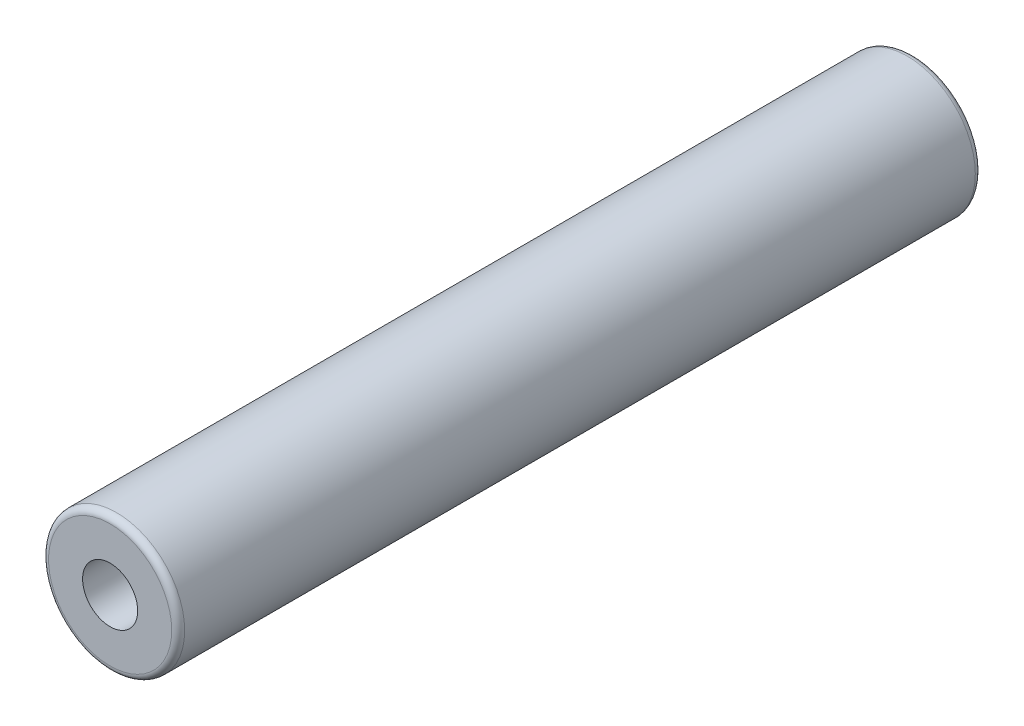
ISO-10303-21;
HEADER;
FILE_DESCRIPTION(('STEP AP214'),'2;1');
FILE_NAME('part.step','',(''),(''),'','','');
FILE_SCHEMA(('AUTOMOTIVE_DESIGN { 1 0 10303 214 1 1 1 1 }'));
ENDSEC;
DATA;
#1=APPLICATION_CONTEXT('core data for automotive mechanical design processes');
#2=APPLICATION_PROTOCOL_DEFINITION('international standard','automotive_design',2000,#1);
#3=PRODUCT_CONTEXT('',#1,'mechanical');
#4=PRODUCT('Part','Part','',(#3));
#5=PRODUCT_RELATED_PRODUCT_CATEGORY('part','',(#4));
#6=PRODUCT_DEFINITION_FORMATION('','',#4);
#7=PRODUCT_DEFINITION_CONTEXT('part definition',#1,'design');
#8=PRODUCT_DEFINITION('design','',#6,#7);
#9=PRODUCT_DEFINITION_SHAPE('','',#8);
#10=(LENGTH_UNIT() NAMED_UNIT(*) SI_UNIT(.MILLI.,.METRE.));
#11=(NAMED_UNIT(*) PLANE_ANGLE_UNIT() SI_UNIT($,.RADIAN.));
#12=(NAMED_UNIT(*) SI_UNIT($,.STERADIAN.) SOLID_ANGLE_UNIT());
#13=UNCERTAINTY_MEASURE_WITH_UNIT(LENGTH_MEASURE(1.E-05),#10,'distance_accuracy_value','');
#14=(GEOMETRIC_REPRESENTATION_CONTEXT(3) GLOBAL_UNCERTAINTY_ASSIGNED_CONTEXT((#13)) GLOBAL_UNIT_ASSIGNED_CONTEXT((#10,
#11,#12)) REPRESENTATION_CONTEXT('',''));
#15=CARTESIAN_POINT('',(0.,0.,0.));
#16=DIRECTION('',(0.,0.,1.));
#17=DIRECTION('',(1.,0.,0.));
#18=AXIS2_PLACEMENT_3D('',#15,#16,#17);
#19=CARTESIAN_POINT('',(-69.9999999999881,54.0000000000047,-124.));
#20=DIRECTION('',(0.,0.,1.));
#21=DIRECTION('',(1.,0.,0.));
#22=AXIS2_PLACEMENT_3D('',#19,#20,#21);
#23=CYLINDRICAL_SURFACE('',#22,10.5);
#24=CARTESIAN_POINT('',(-69.9999999999881,54.0000000000047,-123.));
#25=DIRECTION('',(0.,0.,1.));
#26=DIRECTION('',(1.,0.,0.));
#27=AXIS2_PLACEMENT_3D('',#24,#25,#26);
#28=CIRCLE('',#27,10.5);
#29=CARTESIAN_POINT('',(-59.4999999999882,54.0000000000047,-123.));
#30=VERTEX_POINT('',#29);
#31=EDGE_CURVE('E88',#30,#30,#28,.T.);
#32=ORIENTED_EDGE('',*,*,#31,.T.);
#33=EDGE_LOOP('',(#32));
#34=FACE_BOUND('',#33,.T.);
#35=CARTESIAN_POINT('',(-69.9999999999881,54.0000000000047,-1.));
#36=DIRECTION('',(0.,0.,1.));
#37=DIRECTION('',(1.,0.,0.));
#38=AXIS2_PLACEMENT_3D('',#35,#36,#37);
#39=CIRCLE('',#38,10.5);
#40=CARTESIAN_POINT('',(-59.4999999999882,54.0000000000047,-1.));
#41=VERTEX_POINT('',#40);
#42=EDGE_CURVE('E84',#41,#41,#39,.F.);
#43=ORIENTED_EDGE('',*,*,#42,.T.);
#44=EDGE_LOOP('',(#43));
#45=FACE_BOUND('',#44,.T.);
#46=ADVANCED_FACE('F42',(#34,#45),#23,.T.);
#47=CARTESIAN_POINT('',(-69.9999999999881,54.0000000000047,-124.));
#48=DIRECTION('',(0.,0.,1.));
#49=DIRECTION('',(1.,0.,0.));
#50=AXIS2_PLACEMENT_3D('',#47,#48,#49);
#51=PLANE('',#50);
#52=CARTESIAN_POINT('',(-69.9999999999881,54.0000000000047,-124.));
#53=DIRECTION('',(0.,0.,-1.));
#54=DIRECTION('',(-1.,0.,0.));
#55=AXIS2_PLACEMENT_3D('',#52,#53,#54);
#56=CIRCLE('',#55,4.24999999999999);
#57=CARTESIAN_POINT('',(-74.2499999999881,54.0000000000047,-124.));
#58=VERTEX_POINT('',#57);
#59=EDGE_CURVE('E69',#58,#58,#56,.T.);
#60=ORIENTED_EDGE('',*,*,#59,.F.);
#61=EDGE_LOOP('',(#60));
#62=FACE_BOUND('',#61,.T.);
#63=CARTESIAN_POINT('',(-69.9999999999881,54.0000000000047,-124.));
#64=DIRECTION('',(0.,0.,1.));
#65=DIRECTION('',(1.,0.,0.));
#66=AXIS2_PLACEMENT_3D('',#63,#64,#65);
#67=CIRCLE('',#66,9.5);
#68=CARTESIAN_POINT('',(-60.4999999999882,54.0000000000047,-124.));
#69=VERTEX_POINT('',#68);
#70=EDGE_CURVE('E51',#69,#69,#67,.F.);
#71=ORIENTED_EDGE('',*,*,#70,.T.);
#72=EDGE_LOOP('',(#71));
#73=FACE_BOUND('',#72,.T.);
#74=ADVANCED_FACE('F97',(#62,#73),#51,.F.);
#75=CARTESIAN_POINT('',(-69.9999999999881,54.0000000000047,0.));
#76=DIRECTION('',(0.,0.,1.));
#77=DIRECTION('',(1.,0.,0.));
#78=AXIS2_PLACEMENT_3D('',#75,#76,#77);
#79=PLANE('',#78);
#80=CARTESIAN_POINT('',(-69.9999999999881,54.0000000000047,0.));
#81=DIRECTION('',(0.,0.,1.));
#82=DIRECTION('',(1.,0.,0.));
#83=AXIS2_PLACEMENT_3D('',#80,#81,#82);
#84=CIRCLE('',#83,4.24999999999999);
#85=CARTESIAN_POINT('',(-65.7499999999882,54.0000000000047,0.));
#86=VERTEX_POINT('',#85);
#87=EDGE_CURVE('E68',#86,#86,#84,.T.);
#88=ORIENTED_EDGE('',*,*,#87,.F.);
#89=EDGE_LOOP('',(#88));
#90=FACE_BOUND('',#89,.T.);
#91=CARTESIAN_POINT('',(-69.9999999999881,54.0000000000047,0.));
#92=DIRECTION('',(0.,0.,1.));
#93=DIRECTION('',(1.,0.,0.));
#94=AXIS2_PLACEMENT_3D('',#91,#92,#93);
#95=CIRCLE('',#94,9.5);
#96=CARTESIAN_POINT('',(-60.4999999999882,54.0000000000047,0.));
#97=VERTEX_POINT('',#96);
#98=EDGE_CURVE('E11',#97,#97,#95,.T.);
#99=ORIENTED_EDGE('',*,*,#98,.T.);
#100=EDGE_LOOP('',(#99));
#101=FACE_BOUND('',#100,.T.);
#102=ADVANCED_FACE('F102',(#90,#101),#79,.T.);
#103=CARTESIAN_POINT('',(-69.9999999999881,54.0000000000047,-123.));
#104=DIRECTION('',(0.,0.,1.));
#105=DIRECTION('',(1.,0.,0.));
#106=AXIS2_PLACEMENT_3D('',#103,#104,#105);
#107=TOROIDAL_SURFACE('',#106,9.5,1.);
#108=ORIENTED_EDGE('',*,*,#70,.F.);
#109=EDGE_LOOP('',(#108));
#110=FACE_BOUND('',#109,.T.);
#111=ORIENTED_EDGE('',*,*,#31,.F.);
#112=EDGE_LOOP('',(#111));
#113=FACE_BOUND('',#112,.T.);
#114=ADVANCED_FACE('F99',(#110,#113),#107,.T.);
#115=CARTESIAN_POINT('',(-69.9999999999881,54.0000000000047,-1.));
#116=DIRECTION('',(0.,0.,1.));
#117=DIRECTION('',(1.,0.,0.));
#118=AXIS2_PLACEMENT_3D('',#115,#116,#117);
#119=TOROIDAL_SURFACE('',#118,9.5,1.);
#120=ORIENTED_EDGE('',*,*,#42,.F.);
#121=EDGE_LOOP('',(#120));
#122=FACE_BOUND('',#121,.T.);
#123=ORIENTED_EDGE('',*,*,#98,.F.);
#124=EDGE_LOOP('',(#123));
#125=FACE_BOUND('',#124,.T.);
#126=ADVANCED_FACE('F44',(#122,#125),#119,.T.);
#127=CARTESIAN_POINT('',(-69.9999999999881,54.0000000000047,-25.));
#128=DIRECTION('',(0.,0.,1.));
#129=DIRECTION('',(1.,0.,0.));
#130=AXIS2_PLACEMENT_3D('',#127,#128,#129);
#131=CONICAL_SURFACE('',#130,4.25,1.02974425867666);
#132=CARTESIAN_POINT('',(-69.9999999999881,54.0000000000047,-27.5536576308671));
#133=VERTEX_POINT('',#132);
#134=VERTEX_LOOP('',#133);
#135=FACE_BOUND('',#134,.T.);
#136=CARTESIAN_POINT('',(-69.9999999999881,54.0000000000047,-25.));
#137=DIRECTION('',(0.,0.,1.));
#138=DIRECTION('',(1.,0.,0.));
#139=AXIS2_PLACEMENT_3D('',#136,#137,#138);
#140=CIRCLE('',#139,4.25);
#141=CARTESIAN_POINT('',(-65.7499999999881,54.0000000000047,-25.));
#142=VERTEX_POINT('',#141);
#143=EDGE_CURVE('E76',#142,#142,#140,.T.);
#144=ORIENTED_EDGE('',*,*,#143,.T.);
#145=EDGE_LOOP('',(#144));
#146=FACE_BOUND('',#145,.T.);
#147=ADVANCED_FACE('F112',(#135,#146),#131,.F.);
#148=CARTESIAN_POINT('',(-69.9999999999881,54.0000000000047,0.));
#149=DIRECTION('',(0.,0.,1.));
#150=DIRECTION('',(1.,0.,0.));
#151=AXIS2_PLACEMENT_3D('',#148,#149,#150);
#152=CYLINDRICAL_SURFACE('',#151,4.25);
#153=ORIENTED_EDGE('',*,*,#143,.F.);
#154=EDGE_LOOP('',(#153));
#155=FACE_BOUND('',#154,.T.);
#156=ORIENTED_EDGE('',*,*,#87,.T.);
#157=EDGE_LOOP('',(#156));
#158=FACE_BOUND('',#157,.T.);
#159=ADVANCED_FACE('F61',(#155,#158),#152,.F.);
#160=CARTESIAN_POINT('',(-69.9999999999881,54.0000000000047,-99.));
#161=DIRECTION('',(0.,0.,-1.));
#162=DIRECTION('',(-1.,0.,0.));
#163=AXIS2_PLACEMENT_3D('',#160,#161,#162);
#164=CONICAL_SURFACE('',#163,4.24999999999999,1.02974425867665);
#165=CARTESIAN_POINT('',(-69.9999999999881,54.0000000000047,-96.4463423691329));
#166=VERTEX_POINT('',#165);
#167=VERTEX_LOOP('',#166);
#168=FACE_BOUND('',#167,.T.);
#169=CARTESIAN_POINT('',(-69.9999999999881,54.0000000000047,-99.));
#170=DIRECTION('',(0.,0.,-1.));
#171=DIRECTION('',(-1.,0.,0.));
#172=AXIS2_PLACEMENT_3D('',#169,#170,#171);
#173=CIRCLE('',#172,4.24999999999999);
#174=CARTESIAN_POINT('',(-74.2499999999881,54.0000000000047,-99.));
#175=VERTEX_POINT('',#174);
#176=EDGE_CURVE('E65',#175,#175,#173,.T.);
#177=ORIENTED_EDGE('',*,*,#176,.T.);
#178=EDGE_LOOP('',(#177));
#179=FACE_BOUND('',#178,.T.);
#180=ADVANCED_FACE('F57',(#168,#179),#164,.F.);
#181=CARTESIAN_POINT('',(-69.9999999999881,54.0000000000047,-124.));
#182=DIRECTION('',(0.,0.,-1.));
#183=DIRECTION('',(-1.,0.,0.));
#184=AXIS2_PLACEMENT_3D('',#181,#182,#183);
#185=CYLINDRICAL_SURFACE('',#184,4.24999999999999);
#186=ORIENTED_EDGE('',*,*,#176,.F.);
#187=EDGE_LOOP('',(#186));
#188=FACE_BOUND('',#187,.T.);
#189=ORIENTED_EDGE('',*,*,#59,.T.);
#190=EDGE_LOOP('',(#189));
#191=FACE_BOUND('',#190,.T.);
#192=ADVANCED_FACE('F60',(#188,#191),#185,.F.);
#193=CLOSED_SHELL('',(#46,#74,#102,#114,#126,#147,#159,#180,#192));
#194=MANIFOLD_SOLID_BREP('B2',#193);
#195=ADVANCED_BREP_SHAPE_REPRESENTATION('',(#18,#194),#14);
#196=SHAPE_DEFINITION_REPRESENTATION(#9,#195);
ENDSEC;
END-ISO-10303-21;
